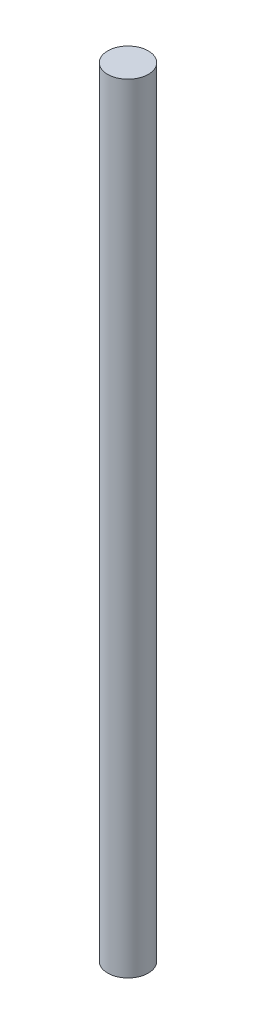
ISO-10303-21;
HEADER;
FILE_DESCRIPTION(('STEP AP214'),'2;1');
FILE_NAME('part.step','',(''),(''),'','','');
FILE_SCHEMA(('AUTOMOTIVE_DESIGN { 1 0 10303 214 1 1 1 1 }'));
ENDSEC;
DATA;
#1=APPLICATION_CONTEXT('core data for automotive mechanical design processes');
#2=APPLICATION_PROTOCOL_DEFINITION('international standard','automotive_design',2000,#1);
#3=PRODUCT_CONTEXT('',#1,'mechanical');
#4=PRODUCT('Part','Part','',(#3));
#5=PRODUCT_RELATED_PRODUCT_CATEGORY('part','',(#4));
#6=PRODUCT_DEFINITION_FORMATION('','',#4);
#7=PRODUCT_DEFINITION_CONTEXT('part definition',#1,'design');
#8=PRODUCT_DEFINITION('design','',#6,#7);
#9=PRODUCT_DEFINITION_SHAPE('','',#8);
#10=(LENGTH_UNIT() NAMED_UNIT(*) SI_UNIT(.MILLI.,.METRE.));
#11=(NAMED_UNIT(*) PLANE_ANGLE_UNIT() SI_UNIT($,.RADIAN.));
#12=(NAMED_UNIT(*) SI_UNIT($,.STERADIAN.) SOLID_ANGLE_UNIT());
#13=UNCERTAINTY_MEASURE_WITH_UNIT(LENGTH_MEASURE(1.E-05),#10,'distance_accuracy_value','');
#14=(GEOMETRIC_REPRESENTATION_CONTEXT(3) GLOBAL_UNCERTAINTY_ASSIGNED_CONTEXT((#13)) GLOBAL_UNIT_ASSIGNED_CONTEXT((#10,
#11,#12)) REPRESENTATION_CONTEXT('',''));
#15=CARTESIAN_POINT('',(0.,0.,0.));
#16=DIRECTION('',(0.,0.,1.));
#17=DIRECTION('',(1.,0.,0.));
#18=AXIS2_PLACEMENT_3D('',#15,#16,#17);
#19=CARTESIAN_POINT('',(0.,121.5,0.));
#20=DIRECTION('',(0.,-1.,0.));
#21=DIRECTION('',(0.,0.,-1.));
#22=AXIS2_PLACEMENT_3D('',#19,#20,#21);
#23=CYLINDRICAL_SURFACE('',#22,6.35);
#24=CARTESIAN_POINT('',(0.,121.5,0.));
#25=DIRECTION('',(0.,1.,0.));
#26=DIRECTION('',(0.,0.,1.));
#27=AXIS2_PLACEMENT_3D('',#24,#25,#26);
#28=CIRCLE('',#27,6.35);
#29=CARTESIAN_POINT('',(0.,121.5,6.35));
#30=VERTEX_POINT('',#29);
#31=EDGE_CURVE('E10',#30,#30,#28,.T.);
#32=ORIENTED_EDGE('',*,*,#31,.F.);
#33=EDGE_LOOP('',(#32));
#34=FACE_BOUND('',#33,.T.);
#35=CARTESIAN_POINT('',(0.,-121.5,0.));
#36=DIRECTION('',(0.,1.,0.));
#37=DIRECTION('',(0.,0.,1.));
#38=AXIS2_PLACEMENT_3D('',#35,#36,#37);
#39=CIRCLE('',#38,6.35);
#40=CARTESIAN_POINT('',(0.,-121.5,6.35));
#41=VERTEX_POINT('',#40);
#42=EDGE_CURVE('E40',#41,#41,#39,.T.);
#43=ORIENTED_EDGE('',*,*,#42,.T.);
#44=EDGE_LOOP('',(#43));
#45=FACE_BOUND('',#44,.T.);
#46=ADVANCED_FACE('F37',(#34,#45),#23,.T.);
#47=CARTESIAN_POINT('',(0.,121.5,0.));
#48=DIRECTION('',(0.,1.,0.));
#49=DIRECTION('',(0.,0.,1.));
#50=AXIS2_PLACEMENT_3D('',#47,#48,#49);
#51=PLANE('',#50);
#52=ORIENTED_EDGE('',*,*,#31,.T.);
#53=EDGE_LOOP('',(#52));
#54=FACE_BOUND('',#53,.T.);
#55=ADVANCED_FACE('F52',(#54),#51,.T.);
#56=CARTESIAN_POINT('',(0.,-121.5,0.));
#57=DIRECTION('',(0.,1.,0.));
#58=DIRECTION('',(0.,0.,1.));
#59=AXIS2_PLACEMENT_3D('',#56,#57,#58);
#60=PLANE('',#59);
#61=ORIENTED_EDGE('',*,*,#42,.F.);
#62=EDGE_LOOP('',(#61));
#63=FACE_BOUND('',#62,.T.);
#64=ADVANCED_FACE('F50',(#63),#60,.F.);
#65=CLOSED_SHELL('',(#46,#55,#64));
#66=MANIFOLD_SOLID_BREP('B2',#65);
#67=ADVANCED_BREP_SHAPE_REPRESENTATION('',(#18,#66),#14);
#68=SHAPE_DEFINITION_REPRESENTATION(#9,#67);
ENDSEC;
END-ISO-10303-21;
